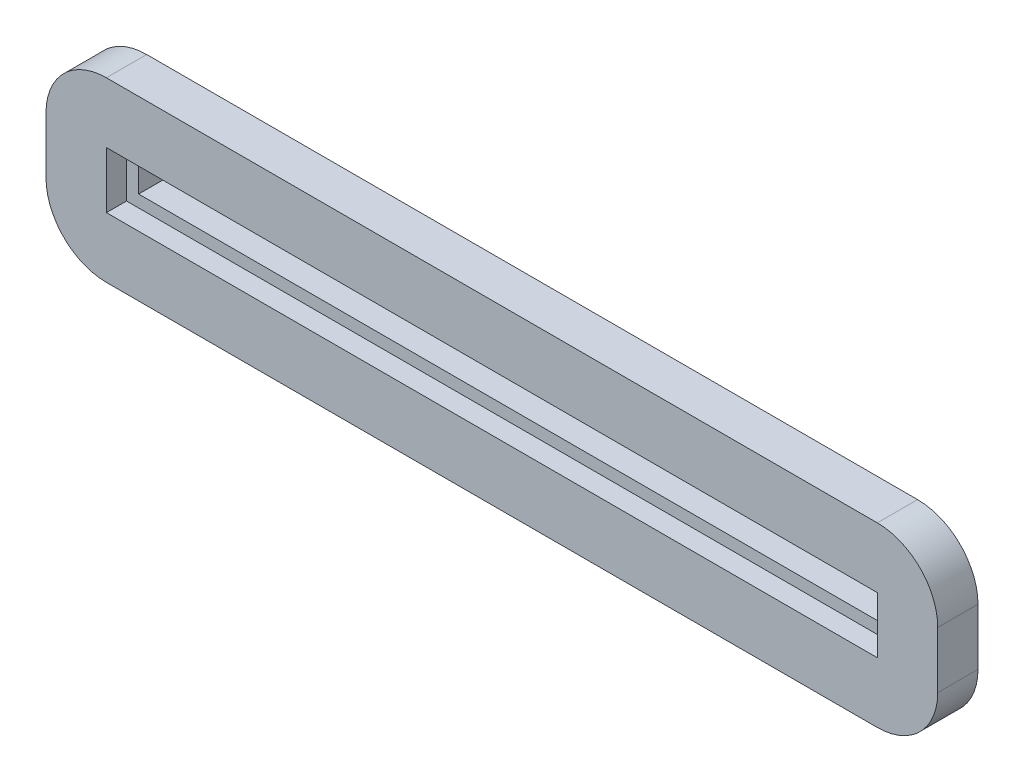
ISO-10303-21;
HEADER;
FILE_DESCRIPTION(('STEP AP214'),'2;1');
FILE_NAME('part.step','',(''),(''),'','','');
FILE_SCHEMA(('AUTOMOTIVE_DESIGN { 1 0 10303 214 1 1 1 1 }'));
ENDSEC;
DATA;
#1=APPLICATION_CONTEXT('core data for automotive mechanical design processes');
#2=APPLICATION_PROTOCOL_DEFINITION('international standard','automotive_design',2000,#1);
#3=PRODUCT_CONTEXT('',#1,'mechanical');
#4=PRODUCT('Part','Part','',(#3));
#5=PRODUCT_RELATED_PRODUCT_CATEGORY('part','',(#4));
#6=PRODUCT_DEFINITION_FORMATION('','',#4);
#7=PRODUCT_DEFINITION_CONTEXT('part definition',#1,'design');
#8=PRODUCT_DEFINITION('design','',#6,#7);
#9=PRODUCT_DEFINITION_SHAPE('','',#8);
#10=(LENGTH_UNIT() NAMED_UNIT(*) SI_UNIT(.MILLI.,.METRE.));
#11=(NAMED_UNIT(*) PLANE_ANGLE_UNIT() SI_UNIT($,.RADIAN.));
#12=(NAMED_UNIT(*) SI_UNIT($,.STERADIAN.) SOLID_ANGLE_UNIT());
#13=UNCERTAINTY_MEASURE_WITH_UNIT(LENGTH_MEASURE(1.E-05),#10,'distance_accuracy_value','');
#14=(GEOMETRIC_REPRESENTATION_CONTEXT(3) GLOBAL_UNCERTAINTY_ASSIGNED_CONTEXT((#13)) GLOBAL_UNIT_ASSIGNED_CONTEXT((#10,
#11,#12)) REPRESENTATION_CONTEXT('',''));
#15=CARTESIAN_POINT('',(0.,0.,0.));
#16=DIRECTION('',(0.,0.,1.));
#17=DIRECTION('',(1.,0.,0.));
#18=AXIS2_PLACEMENT_3D('',#15,#16,#17);
#19=CARTESIAN_POINT('',(104.910814380671,-16.5999999925552,2.));
#20=DIRECTION('',(0.,0.,1.));
#21=DIRECTION('',(1.,0.,0.));
#22=AXIS2_PLACEMENT_3D('',#19,#20,#21);
#23=CYLINDRICAL_SURFACE('',#22,3.);
#24=DIRECTION('',(0.,0.,1.));
#25=VECTOR('',#24,1.);
#26=CARTESIAN_POINT('',(104.910814380671,-13.5999999925552,2.));
#27=LINE('',#26,#25);
#28=CARTESIAN_POINT('',(104.910814380671,-13.5999999925552,2.));
#29=VERTEX_POINT('',#28);
#30=CARTESIAN_POINT('',(104.910814380671,-13.5999999925552,4.));
#31=VERTEX_POINT('',#30);
#32=EDGE_CURVE('E52',#29,#31,#27,.T.);
#33=ORIENTED_EDGE('',*,*,#32,.T.);
#34=CARTESIAN_POINT('',(104.910814380671,-16.5999999925552,4.));
#35=DIRECTION('',(0.,0.,1.));
#36=DIRECTION('',(-1.,0.,0.));
#37=AXIS2_PLACEMENT_3D('',#34,#35,#36);
#38=CIRCLE('',#37,3.);
#39=CARTESIAN_POINT('',(107.910814380671,-16.5999999925552,4.));
#40=VERTEX_POINT('',#39);
#41=EDGE_CURVE('E168',#40,#31,#38,.T.);
#42=ORIENTED_EDGE('',*,*,#41,.F.);
#43=DIRECTION('',(0.,0.,1.));
#44=VECTOR('',#43,1.);
#45=CARTESIAN_POINT('',(107.910814380671,-16.5999999925552,2.));
#46=LINE('',#45,#44);
#47=CARTESIAN_POINT('',(107.910814380671,-16.5999999925552,2.));
#48=VERTEX_POINT('',#47);
#49=EDGE_CURVE('E12',#48,#40,#46,.T.);
#50=ORIENTED_EDGE('',*,*,#49,.F.);
#51=CARTESIAN_POINT('',(104.910814380671,-16.5999999925552,2.));
#52=DIRECTION('',(0.,0.,1.));
#53=DIRECTION('',(-1.,0.,0.));
#54=AXIS2_PLACEMENT_3D('',#51,#52,#53);
#55=CIRCLE('',#54,3.);
#56=EDGE_CURVE('E199',#48,#29,#55,.T.);
#57=ORIENTED_EDGE('',*,*,#56,.T.);
#58=EDGE_LOOP('',(#33,#42,#50,#57));
#59=FACE_BOUND('',#58,.T.);
#60=ADVANCED_FACE('F49',(#59),#23,.T.);
#61=CARTESIAN_POINT('',(107.910814380671,-19.3999999925551,2.));
#62=DIRECTION('',(1.,0.,0.));
#63=DIRECTION('',(0.,1.,0.));
#64=AXIS2_PLACEMENT_3D('',#61,#62,#63);
#65=PLANE('',#64);
#66=ORIENTED_EDGE('',*,*,#49,.T.);
#67=DIRECTION('',(0.,1.,0.));
#68=VECTOR('',#67,1.);
#69=CARTESIAN_POINT('',(107.910814380671,-19.3999999925551,4.));
#70=LINE('',#69,#68);
#71=CARTESIAN_POINT('',(107.910814380671,-19.3999999925551,4.));
#72=VERTEX_POINT('',#71);
#73=EDGE_CURVE('E189',#72,#40,#70,.T.);
#74=ORIENTED_EDGE('',*,*,#73,.F.);
#75=DIRECTION('',(0.,0.,1.));
#76=VECTOR('',#75,1.);
#77=CARTESIAN_POINT('',(107.910814380671,-19.3999999925551,2.));
#78=LINE('',#77,#76);
#79=CARTESIAN_POINT('',(107.910814380671,-19.3999999925551,2.));
#80=VERTEX_POINT('',#79);
#81=EDGE_CURVE('E57',#80,#72,#78,.T.);
#82=ORIENTED_EDGE('',*,*,#81,.F.);
#83=DIRECTION('',(0.,1.,0.));
#84=VECTOR('',#83,1.);
#85=CARTESIAN_POINT('',(107.910814380671,-19.3999999925551,2.));
#86=LINE('',#85,#84);
#87=EDGE_CURVE('E222',#80,#48,#86,.T.);
#88=ORIENTED_EDGE('',*,*,#87,.T.);
#89=EDGE_LOOP('',(#66,#74,#82,#88));
#90=FACE_BOUND('',#89,.T.);
#91=ADVANCED_FACE('F243',(#90),#65,.T.);
#92=CARTESIAN_POINT('',(104.910814380671,-19.3999999925552,2.));
#93=DIRECTION('',(0.,0.,1.));
#94=DIRECTION('',(1.,0.,0.));
#95=AXIS2_PLACEMENT_3D('',#92,#93,#94);
#96=CYLINDRICAL_SURFACE('',#95,3.);
#97=ORIENTED_EDGE('',*,*,#81,.T.);
#98=CARTESIAN_POINT('',(104.910814380671,-19.3999999925552,4.));
#99=DIRECTION('',(0.,0.,1.));
#100=DIRECTION('',(-1.,0.,0.));
#101=AXIS2_PLACEMENT_3D('',#98,#99,#100);
#102=CIRCLE('',#101,3.);
#103=CARTESIAN_POINT('',(104.910814380671,-22.3999999925552,4.));
#104=VERTEX_POINT('',#103);
#105=EDGE_CURVE('E186',#104,#72,#102,.T.);
#106=ORIENTED_EDGE('',*,*,#105,.F.);
#107=DIRECTION('',(0.,0.,1.));
#108=VECTOR('',#107,1.);
#109=CARTESIAN_POINT('',(104.910814380671,-22.3999999925552,2.));
#110=LINE('',#109,#108);
#111=CARTESIAN_POINT('',(104.910814380671,-22.3999999925552,2.));
#112=VERTEX_POINT('',#111);
#113=EDGE_CURVE('E226',#112,#104,#110,.T.);
#114=ORIENTED_EDGE('',*,*,#113,.F.);
#115=CARTESIAN_POINT('',(104.910814380671,-19.3999999925552,2.));
#116=DIRECTION('',(0.,0.,1.));
#117=DIRECTION('',(-1.,0.,0.));
#118=AXIS2_PLACEMENT_3D('',#115,#116,#117);
#119=CIRCLE('',#118,3.);
#120=EDGE_CURVE('E219',#112,#80,#119,.T.);
#121=ORIENTED_EDGE('',*,*,#120,.T.);
#122=EDGE_LOOP('',(#97,#106,#114,#121));
#123=FACE_BOUND('',#122,.T.);
#124=ADVANCED_FACE('F264',(#123),#96,.T.);
#125=CARTESIAN_POINT('',(66.632663677361,-22.3999999925552,2.));
#126=DIRECTION('',(0.,-1.,0.));
#127=DIRECTION('',(0.,0.,-1.));
#128=AXIS2_PLACEMENT_3D('',#125,#126,#127);
#129=PLANE('',#128);
#130=ORIENTED_EDGE('',*,*,#113,.T.);
#131=DIRECTION('',(1.,0.,0.));
#132=VECTOR('',#131,1.);
#133=CARTESIAN_POINT('',(66.632663677361,-22.3999999925552,4.));
#134=LINE('',#133,#132);
#135=CARTESIAN_POINT('',(66.632663677361,-22.3999999925552,4.));
#136=VERTEX_POINT('',#135);
#137=EDGE_CURVE('E183',#136,#104,#134,.T.);
#138=ORIENTED_EDGE('',*,*,#137,.F.);
#139=DIRECTION('',(0.,0.,1.));
#140=VECTOR('',#139,1.);
#141=CARTESIAN_POINT('',(66.632663677361,-22.3999999925552,2.));
#142=LINE('',#141,#140);
#143=CARTESIAN_POINT('',(66.632663677361,-22.3999999925552,2.));
#144=VERTEX_POINT('',#143);
#145=EDGE_CURVE('E228',#144,#136,#142,.T.);
#146=ORIENTED_EDGE('',*,*,#145,.F.);
#147=DIRECTION('',(1.,0.,0.));
#148=VECTOR('',#147,1.);
#149=CARTESIAN_POINT('',(66.632663677361,-22.3999999925552,2.));
#150=LINE('',#149,#148);
#151=EDGE_CURVE('E216',#144,#112,#150,.T.);
#152=ORIENTED_EDGE('',*,*,#151,.T.);
#153=EDGE_LOOP('',(#130,#138,#146,#152));
#154=FACE_BOUND('',#153,.T.);
#155=ADVANCED_FACE('F261',(#154),#129,.T.);
#156=CARTESIAN_POINT('',(66.632663677361,-19.3999999925552,2.));
#157=DIRECTION('',(0.,0.,1.));
#158=DIRECTION('',(1.,0.,0.));
#159=AXIS2_PLACEMENT_3D('',#156,#157,#158);
#160=CYLINDRICAL_SURFACE('',#159,3.);
#161=ORIENTED_EDGE('',*,*,#145,.T.);
#162=CARTESIAN_POINT('',(66.632663677361,-19.3999999925552,4.));
#163=DIRECTION('',(0.,0.,1.));
#164=DIRECTION('',(-1.,0.,0.));
#165=AXIS2_PLACEMENT_3D('',#162,#163,#164);
#166=CIRCLE('',#165,3.);
#167=CARTESIAN_POINT('',(63.632663677361,-19.3999999925551,4.));
#168=VERTEX_POINT('',#167);
#169=EDGE_CURVE('E180',#168,#136,#166,.T.);
#170=ORIENTED_EDGE('',*,*,#169,.F.);
#171=DIRECTION('',(0.,0.,1.));
#172=VECTOR('',#171,1.);
#173=CARTESIAN_POINT('',(63.632663677361,-19.3999999925551,2.));
#174=LINE('',#173,#172);
#175=CARTESIAN_POINT('',(63.632663677361,-19.3999999925551,2.));
#176=VERTEX_POINT('',#175);
#177=EDGE_CURVE('E230',#176,#168,#174,.T.);
#178=ORIENTED_EDGE('',*,*,#177,.F.);
#179=CARTESIAN_POINT('',(66.632663677361,-19.3999999925552,2.));
#180=DIRECTION('',(0.,0.,1.));
#181=DIRECTION('',(-1.,0.,0.));
#182=AXIS2_PLACEMENT_3D('',#179,#180,#181);
#183=CIRCLE('',#182,3.);
#184=EDGE_CURVE('E213',#176,#144,#183,.T.);
#185=ORIENTED_EDGE('',*,*,#184,.T.);
#186=EDGE_LOOP('',(#161,#170,#178,#185));
#187=FACE_BOUND('',#186,.T.);
#188=ADVANCED_FACE('F259',(#187),#160,.T.);
#189=CARTESIAN_POINT('',(63.632663677361,-16.5999999925552,2.));
#190=DIRECTION('',(-1.,0.,0.));
#191=DIRECTION('',(0.,-1.,0.));
#192=AXIS2_PLACEMENT_3D('',#189,#190,#191);
#193=PLANE('',#192);
#194=ORIENTED_EDGE('',*,*,#177,.T.);
#195=DIRECTION('',(0.,-1.,0.));
#196=VECTOR('',#195,1.);
#197=CARTESIAN_POINT('',(63.632663677361,-16.5999999925552,4.));
#198=LINE('',#197,#196);
#199=CARTESIAN_POINT('',(63.632663677361,-16.5999999925552,4.));
#200=VERTEX_POINT('',#199);
#201=EDGE_CURVE('E177',#200,#168,#198,.T.);
#202=ORIENTED_EDGE('',*,*,#201,.F.);
#203=DIRECTION('',(0.,0.,1.));
#204=VECTOR('',#203,1.);
#205=CARTESIAN_POINT('',(63.632663677361,-16.5999999925552,2.));
#206=LINE('',#205,#204);
#207=CARTESIAN_POINT('',(63.632663677361,-16.5999999925552,2.));
#208=VERTEX_POINT('',#207);
#209=EDGE_CURVE('E232',#208,#200,#206,.T.);
#210=ORIENTED_EDGE('',*,*,#209,.F.);
#211=DIRECTION('',(0.,-1.,0.));
#212=VECTOR('',#211,1.);
#213=CARTESIAN_POINT('',(63.632663677361,-16.5999999925552,2.));
#214=LINE('',#213,#212);
#215=EDGE_CURVE('E210',#208,#176,#214,.T.);
#216=ORIENTED_EDGE('',*,*,#215,.T.);
#217=EDGE_LOOP('',(#194,#202,#210,#216));
#218=FACE_BOUND('',#217,.T.);
#219=ADVANCED_FACE('F257',(#218),#193,.T.);
#220=CARTESIAN_POINT('',(66.632663677361,-16.5999999925552,2.));
#221=DIRECTION('',(0.,0.,1.));
#222=DIRECTION('',(1.,0.,0.));
#223=AXIS2_PLACEMENT_3D('',#220,#221,#222);
#224=CYLINDRICAL_SURFACE('',#223,3.);
#225=ORIENTED_EDGE('',*,*,#209,.T.);
#226=CARTESIAN_POINT('',(66.632663677361,-16.5999999925552,4.));
#227=DIRECTION('',(0.,0.,1.));
#228=DIRECTION('',(-1.,0.,0.));
#229=AXIS2_PLACEMENT_3D('',#226,#227,#228);
#230=CIRCLE('',#229,3.);
#231=CARTESIAN_POINT('',(66.632663677361,-13.5999999925552,4.));
#232=VERTEX_POINT('',#231);
#233=EDGE_CURVE('E174',#232,#200,#230,.T.);
#234=ORIENTED_EDGE('',*,*,#233,.F.);
#235=DIRECTION('',(0.,0.,1.));
#236=VECTOR('',#235,1.);
#237=CARTESIAN_POINT('',(66.632663677361,-13.5999999925552,2.));
#238=LINE('',#237,#236);
#239=CARTESIAN_POINT('',(66.632663677361,-13.5999999925552,2.));
#240=VERTEX_POINT('',#239);
#241=EDGE_CURVE('E233',#240,#232,#238,.T.);
#242=ORIENTED_EDGE('',*,*,#241,.F.);
#243=CARTESIAN_POINT('',(66.632663677361,-16.5999999925552,2.));
#244=DIRECTION('',(0.,0.,1.));
#245=DIRECTION('',(-1.,0.,0.));
#246=AXIS2_PLACEMENT_3D('',#243,#244,#245);
#247=CIRCLE('',#246,3.);
#248=EDGE_CURVE('E207',#240,#208,#247,.T.);
#249=ORIENTED_EDGE('',*,*,#248,.T.);
#250=EDGE_LOOP('',(#225,#234,#242,#249));
#251=FACE_BOUND('',#250,.T.);
#252=ADVANCED_FACE('F253',(#251),#224,.T.);
#253=CARTESIAN_POINT('',(104.910814380671,-13.5999999925552,2.));
#254=DIRECTION('',(0.,1.,0.));
#255=DIRECTION('',(0.,0.,1.));
#256=AXIS2_PLACEMENT_3D('',#253,#254,#255);
#257=PLANE('',#256);
#258=ORIENTED_EDGE('',*,*,#241,.T.);
#259=DIRECTION('',(-1.,0.,0.));
#260=VECTOR('',#259,1.);
#261=CARTESIAN_POINT('',(104.910814380671,-13.5999999925552,4.));
#262=LINE('',#261,#260);
#263=EDGE_CURVE('E171',#31,#232,#262,.T.);
#264=ORIENTED_EDGE('',*,*,#263,.F.);
#265=ORIENTED_EDGE('',*,*,#32,.F.);
#266=DIRECTION('',(-1.,0.,0.));
#267=VECTOR('',#266,1.);
#268=CARTESIAN_POINT('',(104.910814380671,-13.5999999925552,2.));
#269=LINE('',#268,#267);
#270=EDGE_CURVE('E204',#29,#240,#269,.T.);
#271=ORIENTED_EDGE('',*,*,#270,.T.);
#272=EDGE_LOOP('',(#258,#264,#265,#271));
#273=FACE_BOUND('',#272,.T.);
#274=ADVANCED_FACE('F237',(#273),#257,.T.);
#275=CARTESIAN_POINT('',(104.910814380671,-16.5999999925552,2.));
#276=DIRECTION('',(0.,0.,-1.));
#277=DIRECTION('',(-1.,0.,0.));
#278=AXIS2_PLACEMENT_3D('',#275,#276,#277);
#279=PLANE('',#278);
#280=DIRECTION('',(-1.,0.,0.));
#281=VECTOR('',#280,1.);
#282=CARTESIAN_POINT('',(104.910814380671,-16.5999999925552,2.));
#283=LINE('',#282,#281);
#284=CARTESIAN_POINT('',(104.910814380671,-16.5999999925552,2.));
#285=VERTEX_POINT('',#284);
#286=CARTESIAN_POINT('',(66.632663677361,-16.5999999925552,2.));
#287=VERTEX_POINT('',#286);
#288=EDGE_CURVE('E192',#285,#287,#283,.T.);
#289=ORIENTED_EDGE('',*,*,#288,.T.);
#290=DIRECTION('',(0.,-1.,0.));
#291=VECTOR('',#290,1.);
#292=CARTESIAN_POINT('',(66.632663677361,-16.5999999925552,2.));
#293=LINE('',#292,#291);
#294=CARTESIAN_POINT('',(66.632663677361,-19.3999999925552,2.));
#295=VERTEX_POINT('',#294);
#296=EDGE_CURVE('E145',#287,#295,#293,.T.);
#297=ORIENTED_EDGE('',*,*,#296,.T.);
#298=DIRECTION('',(1.,0.,0.));
#299=VECTOR('',#298,1.);
#300=CARTESIAN_POINT('',(66.632663677361,-19.3999999925552,2.));
#301=LINE('',#300,#299);
#302=CARTESIAN_POINT('',(104.910814380671,-19.3999999925552,2.));
#303=VERTEX_POINT('',#302);
#304=EDGE_CURVE('E65',#295,#303,#301,.T.);
#305=ORIENTED_EDGE('',*,*,#304,.T.);
#306=DIRECTION('',(0.,1.,0.));
#307=VECTOR('',#306,1.);
#308=CARTESIAN_POINT('',(104.910814380671,-19.3999999925552,2.));
#309=LINE('',#308,#307);
#310=EDGE_CURVE('E150',#303,#285,#309,.T.);
#311=ORIENTED_EDGE('',*,*,#310,.T.);
#312=EDGE_LOOP('',(#289,#297,#305,#311));
#313=FACE_BOUND('',#312,.T.);
#314=ORIENTED_EDGE('',*,*,#56,.F.);
#315=ORIENTED_EDGE('',*,*,#87,.F.);
#316=ORIENTED_EDGE('',*,*,#120,.F.);
#317=ORIENTED_EDGE('',*,*,#151,.F.);
#318=ORIENTED_EDGE('',*,*,#184,.F.);
#319=ORIENTED_EDGE('',*,*,#215,.F.);
#320=ORIENTED_EDGE('',*,*,#248,.F.);
#321=ORIENTED_EDGE('',*,*,#270,.F.);
#322=EDGE_LOOP('',(#314,#315,#316,#317,#318,#319,#320,#321));
#323=FACE_BOUND('',#322,.T.);
#324=ADVANCED_FACE('F247',(#313,#323),#279,.T.);
#325=CARTESIAN_POINT('',(104.910814380671,-16.5999999925552,2.));
#326=DIRECTION('',(0.,1.,0.));
#327=DIRECTION('',(0.,0.,1.));
#328=AXIS2_PLACEMENT_3D('',#325,#326,#327);
#329=PLANE('',#328);
#330=DIRECTION('',(0.,0.,1.));
#331=VECTOR('',#330,1.);
#332=CARTESIAN_POINT('',(104.910814380671,-16.5999999925552,2.));
#333=LINE('',#332,#331);
#334=CARTESIAN_POINT('',(104.910814380671,-16.5999999925552,4.));
#335=VERTEX_POINT('',#334);
#336=EDGE_CURVE('E155',#285,#335,#333,.T.);
#337=ORIENTED_EDGE('',*,*,#336,.T.);
#338=DIRECTION('',(-1.,0.,0.));
#339=VECTOR('',#338,1.);
#340=CARTESIAN_POINT('',(104.910814380671,-16.5999999925552,4.));
#341=LINE('',#340,#339);
#342=CARTESIAN_POINT('',(66.632663677361,-16.5999999925552,4.));
#343=VERTEX_POINT('',#342);
#344=EDGE_CURVE('E153',#335,#343,#341,.T.);
#345=ORIENTED_EDGE('',*,*,#344,.T.);
#346=DIRECTION('',(0.,0.,1.));
#347=VECTOR('',#346,1.);
#348=CARTESIAN_POINT('',(66.632663677361,-16.5999999925552,2.));
#349=LINE('',#348,#347);
#350=EDGE_CURVE('E138',#287,#343,#349,.T.);
#351=ORIENTED_EDGE('',*,*,#350,.F.);
#352=ORIENTED_EDGE('',*,*,#288,.F.);
#353=EDGE_LOOP('',(#337,#345,#351,#352));
#354=FACE_BOUND('',#353,.T.);
#355=ADVANCED_FACE('F154',(#354),#329,.F.);
#356=CARTESIAN_POINT('',(104.910814380671,-19.3999999925552,2.));
#357=DIRECTION('',(1.,0.,0.));
#358=DIRECTION('',(0.,1.,0.));
#359=AXIS2_PLACEMENT_3D('',#356,#357,#358);
#360=PLANE('',#359);
#361=DIRECTION('',(0.,0.,1.));
#362=VECTOR('',#361,1.);
#363=CARTESIAN_POINT('',(104.910814380671,-19.3999999925552,2.));
#364=LINE('',#363,#362);
#365=CARTESIAN_POINT('',(104.910814380671,-19.3999999925552,4.));
#366=VERTEX_POINT('',#365);
#367=EDGE_CURVE('E200',#303,#366,#364,.T.);
#368=ORIENTED_EDGE('',*,*,#367,.T.);
#369=DIRECTION('',(0.,1.,0.));
#370=VECTOR('',#369,1.);
#371=CARTESIAN_POINT('',(104.910814380671,-19.3999999925552,4.));
#372=LINE('',#371,#370);
#373=EDGE_CURVE('E164',#366,#335,#372,.T.);
#374=ORIENTED_EDGE('',*,*,#373,.T.);
#375=ORIENTED_EDGE('',*,*,#336,.F.);
#376=ORIENTED_EDGE('',*,*,#310,.F.);
#377=EDGE_LOOP('',(#368,#374,#375,#376));
#378=FACE_BOUND('',#377,.T.);
#379=ADVANCED_FACE('F341',(#378),#360,.F.);
#380=CARTESIAN_POINT('',(66.632663677361,-19.3999999925552,2.));
#381=DIRECTION('',(0.,-1.,0.));
#382=DIRECTION('',(0.,0.,-1.));
#383=AXIS2_PLACEMENT_3D('',#380,#381,#382);
#384=PLANE('',#383);
#385=DIRECTION('',(0.,0.,1.));
#386=VECTOR('',#385,1.);
#387=CARTESIAN_POINT('',(66.632663677361,-19.3999999925552,2.));
#388=LINE('',#387,#386);
#389=CARTESIAN_POINT('',(66.632663677361,-19.3999999925552,4.));
#390=VERTEX_POINT('',#389);
#391=EDGE_CURVE('E149',#295,#390,#388,.T.);
#392=ORIENTED_EDGE('',*,*,#391,.T.);
#393=DIRECTION('',(1.,0.,0.));
#394=VECTOR('',#393,1.);
#395=CARTESIAN_POINT('',(66.632663677361,-19.3999999925552,4.));
#396=LINE('',#395,#394);
#397=EDGE_CURVE('E162',#390,#366,#396,.T.);
#398=ORIENTED_EDGE('',*,*,#397,.T.);
#399=ORIENTED_EDGE('',*,*,#367,.F.);
#400=ORIENTED_EDGE('',*,*,#304,.F.);
#401=EDGE_LOOP('',(#392,#398,#399,#400));
#402=FACE_BOUND('',#401,.T.);
#403=ADVANCED_FACE('F350',(#402),#384,.F.);
#404=CARTESIAN_POINT('',(66.632663677361,-16.5999999925552,2.));
#405=DIRECTION('',(-1.,0.,0.));
#406=DIRECTION('',(0.,-1.,0.));
#407=AXIS2_PLACEMENT_3D('',#404,#405,#406);
#408=PLANE('',#407);
#409=ORIENTED_EDGE('',*,*,#350,.T.);
#410=DIRECTION('',(0.,-1.,0.));
#411=VECTOR('',#410,1.);
#412=CARTESIAN_POINT('',(66.632663677361,-16.5999999925552,4.));
#413=LINE('',#412,#411);
#414=EDGE_CURVE('E142',#343,#390,#413,.T.);
#415=ORIENTED_EDGE('',*,*,#414,.T.);
#416=ORIENTED_EDGE('',*,*,#391,.F.);
#417=ORIENTED_EDGE('',*,*,#296,.F.);
#418=EDGE_LOOP('',(#409,#415,#416,#417));
#419=FACE_BOUND('',#418,.T.);
#420=ADVANCED_FACE('F140',(#419),#408,.F.);
#421=CARTESIAN_POINT('',(104.910814380671,-16.5999999925552,4.));
#422=DIRECTION('',(0.,0.,-1.));
#423=DIRECTION('',(-1.,0.,0.));
#424=AXIS2_PLACEMENT_3D('',#421,#422,#423);
#425=PLANE('',#424);
#426=ORIENTED_EDGE('',*,*,#41,.T.);
#427=ORIENTED_EDGE('',*,*,#263,.T.);
#428=ORIENTED_EDGE('',*,*,#233,.T.);
#429=ORIENTED_EDGE('',*,*,#201,.T.);
#430=ORIENTED_EDGE('',*,*,#169,.T.);
#431=ORIENTED_EDGE('',*,*,#137,.T.);
#432=ORIENTED_EDGE('',*,*,#105,.T.);
#433=ORIENTED_EDGE('',*,*,#73,.T.);
#434=EDGE_LOOP('',(#426,#427,#428,#429,#430,#431,#432,#433));
#435=FACE_BOUND('',#434,.T.);
#436=ORIENTED_EDGE('',*,*,#344,.F.);
#437=ORIENTED_EDGE('',*,*,#373,.F.);
#438=ORIENTED_EDGE('',*,*,#397,.F.);
#439=ORIENTED_EDGE('',*,*,#414,.F.);
#440=EDGE_LOOP('',(#436,#437,#438,#439));
#441=FACE_BOUND('',#440,.T.);
#442=ADVANCED_FACE('F160',(#435,#441),#425,.F.);
#443=CLOSED_SHELL('',(#60,#91,#124,#155,#188,#219,#252,#274,#324,#355,#379,#403,#420,#442));
#444=MANIFOLD_SOLID_BREP('B2',#443);
#445=CARTESIAN_POINT('',(66.632663677361,-16.5999999925552,3.));
#446=DIRECTION('',(1.,0.,0.));
#447=DIRECTION('',(0.,1.,0.));
#448=AXIS2_PLACEMENT_3D('',#445,#446,#447);
#449=PLANE('',#448);
#450=DIRECTION('',(0.,-1.,0.));
#451=VECTOR('',#450,1.);
#452=CARTESIAN_POINT('',(66.632663677361,-16.5999999925552,0.));
#453=LINE('',#452,#451);
#454=CARTESIAN_POINT('',(66.632663677361,-16.5999999925552,0.));
#455=VERTEX_POINT('',#454);
#456=CARTESIAN_POINT('',(66.632663677361,-19.3999999925552,0.));
#457=VERTEX_POINT('',#456);
#458=EDGE_CURVE('E491',#455,#457,#453,.T.);
#459=ORIENTED_EDGE('',*,*,#458,.T.);
#460=DIRECTION('',(0.,0.,-1.));
#461=VECTOR('',#460,1.);
#462=CARTESIAN_POINT('',(66.632663677361,-19.3999999925552,3.));
#463=LINE('',#462,#461);
#464=CARTESIAN_POINT('',(66.632663677361,-19.3999999925552,3.));
#465=VERTEX_POINT('',#464);
#466=EDGE_CURVE('E47',#465,#457,#463,.T.);
#467=ORIENTED_EDGE('',*,*,#466,.F.);
#468=DIRECTION('',(0.,-1.,0.));
#469=VECTOR('',#468,1.);
#470=CARTESIAN_POINT('',(66.632663677361,-16.5999999925552,3.));
#471=LINE('',#470,#469);
#472=CARTESIAN_POINT('',(66.632663677361,-16.5999999925552,3.));
#473=VERTEX_POINT('',#472);
#474=EDGE_CURVE('E495',#473,#465,#471,.T.);
#475=ORIENTED_EDGE('',*,*,#474,.F.);
#476=DIRECTION('',(0.,0.,-1.));
#477=VECTOR('',#476,1.);
#478=CARTESIAN_POINT('',(66.632663677361,-16.5999999925552,3.));
#479=LINE('',#478,#477);
#480=EDGE_CURVE('E501',#473,#455,#479,.T.);
#481=ORIENTED_EDGE('',*,*,#480,.T.);
#482=EDGE_LOOP('',(#459,#467,#475,#481));
#483=FACE_BOUND('',#482,.T.);
#484=ADVANCED_FACE('F383',(#483),#449,.F.);
#485=CARTESIAN_POINT('',(66.632663677361,-19.3999999925552,3.));
#486=DIRECTION('',(0.,1.,0.));
#487=DIRECTION('',(0.,0.,1.));
#488=AXIS2_PLACEMENT_3D('',#485,#486,#487);
#489=PLANE('',#488);
#490=DIRECTION('',(1.,0.,0.));
#491=VECTOR('',#490,1.);
#492=CARTESIAN_POINT('',(66.632663677361,-19.3999999925552,0.));
#493=LINE('',#492,#491);
#494=CARTESIAN_POINT('',(104.910814380671,-19.3999999925552,0.));
#495=VERTEX_POINT('',#494);
#496=EDGE_CURVE('E504',#457,#495,#493,.T.);
#497=ORIENTED_EDGE('',*,*,#496,.T.);
#498=DIRECTION('',(0.,0.,-1.));
#499=VECTOR('',#498,1.);
#500=CARTESIAN_POINT('',(104.910814380671,-19.3999999925552,3.));
#501=LINE('',#500,#499);
#502=CARTESIAN_POINT('',(104.910814380671,-19.3999999925552,3.));
#503=VERTEX_POINT('',#502);
#504=EDGE_CURVE('E390',#503,#495,#501,.T.);
#505=ORIENTED_EDGE('',*,*,#504,.F.);
#506=DIRECTION('',(1.,0.,0.));
#507=VECTOR('',#506,1.);
#508=CARTESIAN_POINT('',(66.632663677361,-19.3999999925552,3.));
#509=LINE('',#508,#507);
#510=EDGE_CURVE('E434',#465,#503,#509,.T.);
#511=ORIENTED_EDGE('',*,*,#510,.F.);
#512=ORIENTED_EDGE('',*,*,#466,.T.);
#513=EDGE_LOOP('',(#497,#505,#511,#512));
#514=FACE_BOUND('',#513,.T.);
#515=ADVANCED_FACE('F534',(#514),#489,.F.);
#516=CARTESIAN_POINT('',(104.910814380671,-19.3999999925552,3.));
#517=DIRECTION('',(-1.,0.,0.));
#518=DIRECTION('',(0.,-1.,0.));
#519=AXIS2_PLACEMENT_3D('',#516,#517,#518);
#520=PLANE('',#519);
#521=DIRECTION('',(0.,1.,0.));
#522=VECTOR('',#521,1.);
#523=CARTESIAN_POINT('',(104.910814380671,-19.3999999925552,0.));
#524=LINE('',#523,#522);
#525=CARTESIAN_POINT('',(104.910814380671,-16.5999999925552,0.));
#526=VERTEX_POINT('',#525);
#527=EDGE_CURVE('E506',#495,#526,#524,.T.);
#528=ORIENTED_EDGE('',*,*,#527,.T.);
#529=DIRECTION('',(0.,0.,-1.));
#530=VECTOR('',#529,1.);
#531=CARTESIAN_POINT('',(104.910814380671,-16.5999999925552,3.));
#532=LINE('',#531,#530);
#533=CARTESIAN_POINT('',(104.910814380671,-16.5999999925552,3.));
#534=VERTEX_POINT('',#533);
#535=EDGE_CURVE('E510',#534,#526,#532,.T.);
#536=ORIENTED_EDGE('',*,*,#535,.F.);
#537=DIRECTION('',(0.,1.,0.));
#538=VECTOR('',#537,1.);
#539=CARTESIAN_POINT('',(104.910814380671,-19.3999999925552,3.));
#540=LINE('',#539,#538);
#541=EDGE_CURVE('E498',#503,#534,#540,.T.);
#542=ORIENTED_EDGE('',*,*,#541,.F.);
#543=ORIENTED_EDGE('',*,*,#504,.T.);
#544=EDGE_LOOP('',(#528,#536,#542,#543));
#545=FACE_BOUND('',#544,.T.);
#546=ADVANCED_FACE('F515',(#545),#520,.F.);
#547=CARTESIAN_POINT('',(104.910814380671,-16.5999999925552,3.));
#548=DIRECTION('',(0.,-1.,0.));
#549=DIRECTION('',(0.,0.,-1.));
#550=AXIS2_PLACEMENT_3D('',#547,#548,#549);
#551=PLANE('',#550);
#552=DIRECTION('',(-1.,0.,0.));
#553=VECTOR('',#552,1.);
#554=CARTESIAN_POINT('',(104.910814380671,-16.5999999925552,0.));
#555=LINE('',#554,#553);
#556=EDGE_CURVE('E427',#526,#455,#555,.T.);
#557=ORIENTED_EDGE('',*,*,#556,.T.);
#558=ORIENTED_EDGE('',*,*,#480,.F.);
#559=DIRECTION('',(-1.,0.,0.));
#560=VECTOR('',#559,1.);
#561=CARTESIAN_POINT('',(104.910814380671,-16.5999999925552,3.));
#562=LINE('',#561,#560);
#563=EDGE_CURVE('E406',#534,#473,#562,.T.);
#564=ORIENTED_EDGE('',*,*,#563,.F.);
#565=ORIENTED_EDGE('',*,*,#535,.T.);
#566=EDGE_LOOP('',(#557,#558,#564,#565));
#567=FACE_BOUND('',#566,.T.);
#568=ADVANCED_FACE('F523',(#567),#551,.F.);
#569=CARTESIAN_POINT('',(0.,0.,3.));
#570=DIRECTION('',(0.,0.,1.));
#571=DIRECTION('',(1.,0.,0.));
#572=AXIS2_PLACEMENT_3D('',#569,#570,#571);
#573=PLANE('',#572);
#574=DIRECTION('',(0.,1.,0.));
#575=VECTOR('',#574,1.);
#576=CARTESIAN_POINT('',(104.310814380671,-18.7999999925552,3.));
#577=LINE('',#576,#575);
#578=CARTESIAN_POINT('',(104.310814380671,-18.7999999925552,3.));
#579=VERTEX_POINT('',#578);
#580=CARTESIAN_POINT('',(104.310814380671,-17.1999999925552,3.));
#581=VERTEX_POINT('',#580);
#582=EDGE_CURVE('E397',#579,#581,#577,.T.);
#583=ORIENTED_EDGE('',*,*,#582,.F.);
#584=DIRECTION('',(1.,0.,0.));
#585=VECTOR('',#584,1.);
#586=CARTESIAN_POINT('',(67.232663677361,-18.7999999925552,3.));
#587=LINE('',#586,#585);
#588=CARTESIAN_POINT('',(67.232663677361,-18.7999999925552,3.));
#589=VERTEX_POINT('',#588);
#590=EDGE_CURVE('E476',#589,#579,#587,.T.);
#591=ORIENTED_EDGE('',*,*,#590,.F.);
#592=DIRECTION('',(0.,-1.,0.));
#593=VECTOR('',#592,1.);
#594=CARTESIAN_POINT('',(67.232663677361,-17.1999999925552,3.));
#595=LINE('',#594,#593);
#596=CARTESIAN_POINT('',(67.232663677361,-17.1999999925552,3.));
#597=VERTEX_POINT('',#596);
#598=EDGE_CURVE('E479',#597,#589,#595,.T.);
#599=ORIENTED_EDGE('',*,*,#598,.F.);
#600=DIRECTION('',(-1.,0.,0.));
#601=VECTOR('',#600,1.);
#602=CARTESIAN_POINT('',(104.310814380671,-17.1999999925552,3.));
#603=LINE('',#602,#601);
#604=EDGE_CURVE('E485',#581,#597,#603,.T.);
#605=ORIENTED_EDGE('',*,*,#604,.F.);
#606=EDGE_LOOP('',(#583,#591,#599,#605));
#607=FACE_BOUND('',#606,.T.);
#608=ORIENTED_EDGE('',*,*,#474,.T.);
#609=ORIENTED_EDGE('',*,*,#510,.T.);
#610=ORIENTED_EDGE('',*,*,#541,.T.);
#611=ORIENTED_EDGE('',*,*,#563,.T.);
#612=EDGE_LOOP('',(#608,#609,#610,#611));
#613=FACE_BOUND('',#612,.T.);
#614=ADVANCED_FACE('F525',(#607,#613),#573,.T.);
#615=CARTESIAN_POINT('',(0.,0.,0.));
#616=DIRECTION('',(0.,0.,1.));
#617=DIRECTION('',(1.,0.,0.));
#618=AXIS2_PLACEMENT_3D('',#615,#616,#617);
#619=PLANE('',#618);
#620=ORIENTED_EDGE('',*,*,#458,.F.);
#621=ORIENTED_EDGE('',*,*,#556,.F.);
#622=ORIENTED_EDGE('',*,*,#527,.F.);
#623=ORIENTED_EDGE('',*,*,#496,.F.);
#624=EDGE_LOOP('',(#620,#621,#622,#623));
#625=FACE_BOUND('',#624,.T.);
#626=ADVANCED_FACE('F519',(#625),#619,.F.);
#627=CARTESIAN_POINT('',(104.310814380671,-18.7999999925552,0.5));
#628=DIRECTION('',(1.,0.,0.));
#629=DIRECTION('',(0.,0.,-1.));
#630=AXIS2_PLACEMENT_3D('',#627,#628,#629);
#631=PLANE('',#630);
#632=ORIENTED_EDGE('',*,*,#582,.T.);
#633=DIRECTION('',(0.,0.,1.));
#634=VECTOR('',#633,1.);
#635=CARTESIAN_POINT('',(104.310814380671,-17.1999999925552,0.5));
#636=LINE('',#635,#634);
#637=CARTESIAN_POINT('',(104.310814380671,-17.1999999925552,0.5));
#638=VERTEX_POINT('',#637);
#639=EDGE_CURVE('E454',#638,#581,#636,.T.);
#640=ORIENTED_EDGE('',*,*,#639,.F.);
#641=DIRECTION('',(0.,1.,0.));
#642=VECTOR('',#641,1.);
#643=CARTESIAN_POINT('',(104.310814380671,-18.7999999925552,0.5));
#644=LINE('',#643,#642);
#645=CARTESIAN_POINT('',(104.310814380671,-18.7999999925552,0.5));
#646=VERTEX_POINT('',#645);
#647=EDGE_CURVE('E458',#646,#638,#644,.T.);
#648=ORIENTED_EDGE('',*,*,#647,.F.);
#649=DIRECTION('',(0.,0.,1.));
#650=VECTOR('',#649,1.);
#651=CARTESIAN_POINT('',(104.310814380671,-18.7999999925552,0.5));
#652=LINE('',#651,#650);
#653=EDGE_CURVE('E489',#646,#579,#652,.T.);
#654=ORIENTED_EDGE('',*,*,#653,.T.);
#655=EDGE_LOOP('',(#632,#640,#648,#654));
#656=FACE_BOUND('',#655,.T.);
#657=ADVANCED_FACE('F456',(#656),#631,.F.);
#658=CARTESIAN_POINT('',(67.232663677361,-18.7999999925552,0.5));
#659=DIRECTION('',(0.,-1.,0.));
#660=DIRECTION('',(1.,0.,0.));
#661=AXIS2_PLACEMENT_3D('',#658,#659,#660);
#662=PLANE('',#661);
#663=ORIENTED_EDGE('',*,*,#590,.T.);
#664=ORIENTED_EDGE('',*,*,#653,.F.);
#665=DIRECTION('',(1.,0.,0.));
#666=VECTOR('',#665,1.);
#667=CARTESIAN_POINT('',(67.232663677361,-18.7999999925552,0.5));
#668=LINE('',#667,#666);
#669=CARTESIAN_POINT('',(67.232663677361,-18.7999999925552,0.5));
#670=VERTEX_POINT('',#669);
#671=EDGE_CURVE('E464',#670,#646,#668,.T.);
#672=ORIENTED_EDGE('',*,*,#671,.F.);
#673=DIRECTION('',(0.,0.,1.));
#674=VECTOR('',#673,1.);
#675=CARTESIAN_POINT('',(67.232663677361,-18.7999999925552,0.5));
#676=LINE('',#675,#674);
#677=EDGE_CURVE('E492',#670,#589,#676,.T.);
#678=ORIENTED_EDGE('',*,*,#677,.T.);
#679=EDGE_LOOP('',(#663,#664,#672,#678));
#680=FACE_BOUND('',#679,.T.);
#681=ADVANCED_FACE('F574',(#680),#662,.F.);
#682=CARTESIAN_POINT('',(67.232663677361,-17.1999999925552,0.5));
#683=DIRECTION('',(-1.,0.,0.));
#684=DIRECTION('',(0.,0.,1.));
#685=AXIS2_PLACEMENT_3D('',#682,#683,#684);
#686=PLANE('',#685);
#687=ORIENTED_EDGE('',*,*,#598,.T.);
#688=ORIENTED_EDGE('',*,*,#677,.F.);
#689=DIRECTION('',(0.,-1.,0.));
#690=VECTOR('',#689,1.);
#691=CARTESIAN_POINT('',(67.232663677361,-17.1999999925552,0.5));
#692=LINE('',#691,#690);
#693=CARTESIAN_POINT('',(67.232663677361,-17.1999999925552,0.5));
#694=VERTEX_POINT('',#693);
#695=EDGE_CURVE('E472',#694,#670,#692,.T.);
#696=ORIENTED_EDGE('',*,*,#695,.F.);
#697=DIRECTION('',(0.,0.,1.));
#698=VECTOR('',#697,1.);
#699=CARTESIAN_POINT('',(67.232663677361,-17.1999999925552,0.5));
#700=LINE('',#699,#698);
#701=EDGE_CURVE('E463',#694,#597,#700,.T.);
#702=ORIENTED_EDGE('',*,*,#701,.T.);
#703=EDGE_LOOP('',(#687,#688,#696,#702));
#704=FACE_BOUND('',#703,.T.);
#705=ADVANCED_FACE('F583',(#704),#686,.F.);
#706=CARTESIAN_POINT('',(104.310814380671,-17.1999999925552,0.5));
#707=DIRECTION('',(0.,1.,0.));
#708=DIRECTION('',(-1.,0.,0.));
#709=AXIS2_PLACEMENT_3D('',#706,#707,#708);
#710=PLANE('',#709);
#711=ORIENTED_EDGE('',*,*,#604,.T.);
#712=ORIENTED_EDGE('',*,*,#701,.F.);
#713=DIRECTION('',(-1.,0.,0.));
#714=VECTOR('',#713,1.);
#715=CARTESIAN_POINT('',(104.310814380671,-17.1999999925552,0.5));
#716=LINE('',#715,#714);
#717=EDGE_CURVE('E467',#638,#694,#716,.T.);
#718=ORIENTED_EDGE('',*,*,#717,.F.);
#719=ORIENTED_EDGE('',*,*,#639,.T.);
#720=EDGE_LOOP('',(#711,#712,#718,#719));
#721=FACE_BOUND('',#720,.T.);
#722=ADVANCED_FACE('F468',(#721),#710,.F.);
#723=CARTESIAN_POINT('',(0.,0.,0.5));
#724=DIRECTION('',(0.,0.,1.));
#725=DIRECTION('',(1.,0.,0.));
#726=AXIS2_PLACEMENT_3D('',#723,#724,#725);
#727=PLANE('',#726);
#728=ORIENTED_EDGE('',*,*,#647,.T.);
#729=ORIENTED_EDGE('',*,*,#717,.T.);
#730=ORIENTED_EDGE('',*,*,#695,.T.);
#731=ORIENTED_EDGE('',*,*,#671,.T.);
#732=EDGE_LOOP('',(#728,#729,#730,#731));
#733=FACE_BOUND('',#732,.T.);
#734=ADVANCED_FACE('F474',(#733),#727,.T.);
#735=CLOSED_SHELL('',(#484,#515,#546,#568,#614,#626,#657,#681,#705,#722,#734));
#736=MANIFOLD_SOLID_BREP('B6',#735);
#737=ADVANCED_BREP_SHAPE_REPRESENTATION('',(#18,#444,#736),#14);
#738=SHAPE_DEFINITION_REPRESENTATION(#9,#737);
ENDSEC;
END-ISO-10303-21;
